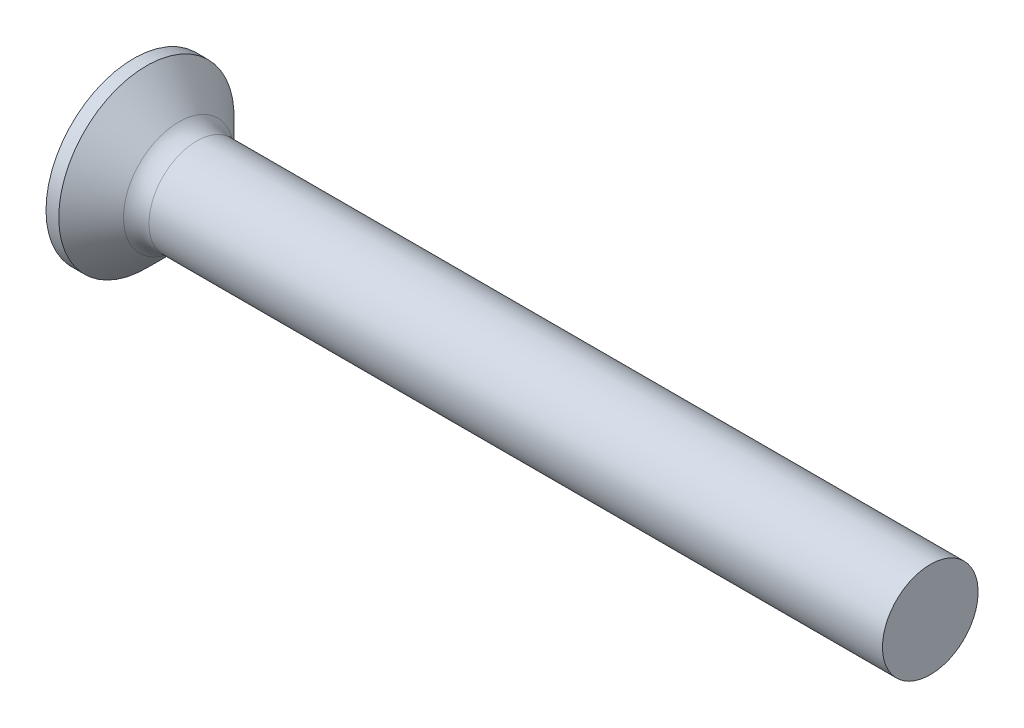
ISO-10303-21;
HEADER;
FILE_DESCRIPTION(('STEP AP214'),'2;1');
FILE_NAME('part.step','',(''),(''),'','','');
FILE_SCHEMA(('AUTOMOTIVE_DESIGN { 1 0 10303 214 1 1 1 1 }'));
ENDSEC;
DATA;
#1=APPLICATION_CONTEXT('core data for automotive mechanical design processes');
#2=APPLICATION_PROTOCOL_DEFINITION('international standard','automotive_design',2000,#1);
#3=PRODUCT_CONTEXT('',#1,'mechanical');
#4=PRODUCT('Part','Part','',(#3));
#5=PRODUCT_RELATED_PRODUCT_CATEGORY('part','',(#4));
#6=PRODUCT_DEFINITION_FORMATION('','',#4);
#7=PRODUCT_DEFINITION_CONTEXT('part definition',#1,'design');
#8=PRODUCT_DEFINITION('design','',#6,#7);
#9=PRODUCT_DEFINITION_SHAPE('','',#8);
#10=(LENGTH_UNIT() NAMED_UNIT(*) SI_UNIT(.MILLI.,.METRE.));
#11=(NAMED_UNIT(*) PLANE_ANGLE_UNIT() SI_UNIT($,.RADIAN.));
#12=(NAMED_UNIT(*) SI_UNIT($,.STERADIAN.) SOLID_ANGLE_UNIT());
#13=UNCERTAINTY_MEASURE_WITH_UNIT(LENGTH_MEASURE(1.E-05),#10,'distance_accuracy_value','');
#14=(GEOMETRIC_REPRESENTATION_CONTEXT(3) GLOBAL_UNCERTAINTY_ASSIGNED_CONTEXT((#13)) GLOBAL_UNIT_ASSIGNED_CONTEXT((#10,
#11,#12)) REPRESENTATION_CONTEXT('',''));
#15=CARTESIAN_POINT('',(0.,0.,0.));
#16=DIRECTION('',(0.,0.,1.));
#17=DIRECTION('',(1.,0.,0.));
#18=AXIS2_PLACEMENT_3D('',#15,#16,#17);
#19=CARTESIAN_POINT('',(2.01,-0.497851135403458,0.37));
#20=DIRECTION('',(0.,0.,-1.));
#21=DIRECTION('',(0.,1.,0.));
#22=AXIS2_PLACEMENT_3D('',#19,#20,#21);
#23=PLANE('',#22);
#24=DIRECTION('',(0.,-1.,0.));
#25=VECTOR('',#24,1.);
#26=CARTESIAN_POINT('',(0.,1.5,0.37));
#27=LINE('',#26,#25);
#28=CARTESIAN_POINT('',(0.,-0.590157547916263,0.37));
#29=VERTEX_POINT('',#28);
#30=CARTESIAN_POINT('',(0.,-1.5,0.37));
#31=VERTEX_POINT('',#30);
#32=EDGE_CURVE('E459',#29,#31,#27,.T.);
#33=ORIENTED_EDGE('',*,*,#32,.F.);
#34=CARTESIAN_POINT('',(-1.01053649691082,-0.672102030072118,0.37));
#35=CARTESIAN_POINT('',(-0.79970605871103,-0.655267098883947,0.37));
#36=CARTESIAN_POINT('',(-0.588886212503304,-0.638297110572311,0.37));
#37=CARTESIAN_POINT('',(-0.167272662529611,-0.603984130519828,0.37));
#38=CARTESIAN_POINT('',(0.0435210406290471,-0.586641131324258,0.37));
#39=CARTESIAN_POINT('',(0.465068838244709,-0.551479911667385,0.37));
#40=CARTESIAN_POINT('',(0.67582293271526,-0.533661691368909,0.37));
#41=CARTESIAN_POINT('',(1.09727362083221,-0.497387538872971,0.37));
#42=CARTESIAN_POINT('',(1.30797021521736,-0.478931615299089,0.37));
#43=CARTESIAN_POINT('',(1.67418894757201,-0.446067164121905,0.37));
#44=CARTESIAN_POINT('',(1.82972932585734,-0.431862501028414,0.37));
#45=CARTESIAN_POINT('',(2.14074770359484,-0.40279770973988,0.37));
#46=CARTESIAN_POINT('',(2.29622570356215,-0.38793758707517,0.37));
#47=CARTESIAN_POINT('',(2.60710169348415,-0.357305117937676,0.37));
#48=CARTESIAN_POINT('',(2.76249967840253,-0.34153271979064,0.37));
#49=CARTESIAN_POINT('',(2.99549070742189,-0.316847908281595,0.37));
#50=CARTESIAN_POINT('',(3.07313791118864,-0.308448465897182,0.37));
#51=CARTESIAN_POINT('',(3.22838341575769,-0.291202251048339,0.37));
#52=CARTESIAN_POINT('',(3.30598171599396,-0.282355473499083,0.37));
#53=CARTESIAN_POINT('',(3.38354828463398,-0.273232461289951,0.37));
#54=B_SPLINE_CURVE_WITH_KNOTS('',3,(#34,#35,#36,#37,#38,#39,#40,#41,#42,#43,#44,#45,#46,#47,#48,
#49,#50,#51,#52,#53),.UNSPECIFIED.,.F.,.F.,(4,2,2,2,2,2,2,2,2,4),(0.,0.634504777554396,
1.26902224766093,1.90353950036111,2.53804817592041,3.00661008438666,3.47516804019383,
3.94375256268972,4.17805198331267,4.41235406779909),.UNSPECIFIED.);
#55=CARTESIAN_POINT('',(2.01,-0.415013252800437,0.37));
#56=VERTEX_POINT('',#55);
#57=EDGE_CURVE('E214',#29,#56,#54,.T.);
#58=ORIENTED_EDGE('',*,*,#57,.T.);
#59=DIRECTION('',(0.,-1.,0.));
#60=VECTOR('',#59,1.);
#61=CARTESIAN_POINT('',(2.01,0.497851135403459,0.37));
#62=LINE('',#61,#60);
#63=CARTESIAN_POINT('',(2.01,-0.497851135403458,0.37));
#64=VERTEX_POINT('',#63);
#65=EDGE_CURVE('E367',#56,#64,#62,.T.);
#66=ORIENTED_EDGE('',*,*,#65,.T.);
#67=DIRECTION('',(0.894934391398442,0.446197753347436,0.));
#68=VECTOR('',#67,1.);
#69=CARTESIAN_POINT('',(0.,-1.5,0.37));
#70=LINE('',#69,#68);
#71=EDGE_CURVE('E467',#31,#64,#70,.T.);
#72=ORIENTED_EDGE('',*,*,#71,.F.);
#73=EDGE_LOOP('',(#33,#58,#66,#72));
#74=FACE_BOUND('',#73,.T.);
#75=ADVANCED_FACE('F35',(#74),#23,.T.);
#76=CARTESIAN_POINT('',(2.01,0.497851135403459,0.37));
#77=VERTEX_POINT('',#76);
#78=CARTESIAN_POINT('',(2.01,0.415013252800437,0.37));
#79=VERTEX_POINT('',#78);
#80=EDGE_CURVE('E363',#77,#79,#62,.T.);
#81=ORIENTED_EDGE('',*,*,#80,.T.);
#82=CARTESIAN_POINT('',(-1.01053649699026,0.672102030078459,0.37));
#83=CARTESIAN_POINT('',(-0.799706058781648,0.65526709888962,0.37));
#84=CARTESIAN_POINT('',(-0.588886212565099,0.638297110577309,0.37));
#85=CARTESIAN_POINT('',(-0.167272662573759,0.603984130523453,0.37));
#86=CARTESIAN_POINT('',(0.043521040593722,0.586641131327185,0.37));
#87=CARTESIAN_POINT('',(0.465068838236453,0.551479911668094,0.37));
#88=CARTESIAN_POINT('',(0.675822932725248,0.533661691368078,0.37));
#89=CARTESIAN_POINT('',(1.09727362087867,0.497387538868943,0.37));
#90=CARTESIAN_POINT('',(1.30797021528206,0.478931615293404,0.37));
#91=CARTESIAN_POINT('',(1.67418894765493,0.446067164114376,0.37));
#92=CARTESIAN_POINT('',(1.82972932594025,0.431862501020785,0.37));
#93=CARTESIAN_POINT('',(2.14074770367772,0.402797709732015,0.37));
#94=CARTESIAN_POINT('',(2.29622570364503,0.38793758706717,0.37));
#95=CARTESIAN_POINT('',(2.60710169356699,0.357305117929346,0.37));
#96=CARTESIAN_POINT('',(2.76249967848536,0.341532719782116,0.37));
#97=CARTESIAN_POINT('',(2.99549070750468,0.316847908272698,0.37));
#98=CARTESIAN_POINT('',(3.07313791127142,0.308448465888148,0.37));
#99=CARTESIAN_POINT('',(3.22838341584044,0.291202251038989,0.37));
#100=CARTESIAN_POINT('',(3.30598171607669,0.282355473489554,0.37));
#101=CARTESIAN_POINT('',(3.38354828471668,0.273232461280216,0.37));
#102=B_SPLINE_CURVE_WITH_KNOTS('',3,(#82,#83,#84,#85,#86,#87,#88,#89,#90,#91,#92,#93,#94,#95,
#96,#97,#98,#99,#100,#101),.UNSPECIFIED.,.F.,.F.,(4,2,2,2,2,2,2,2,2,4),(0.,0.634504777580944,
1.26902224771403,1.90353950046914,2.53804817608336,3.00661008454961,3.47516804035678,
3.94375256285268,4.17805198347564,4.41235406796206),.UNSPECIFIED.);
#103=CARTESIAN_POINT('',(0.,0.590157547916263,0.37));
#104=VERTEX_POINT('',#103);
#105=EDGE_CURVE('E207',#79,#104,#102,.F.);
#106=ORIENTED_EDGE('',*,*,#105,.T.);
#107=CARTESIAN_POINT('',(0.,1.5,0.37));
#108=VERTEX_POINT('',#107);
#109=EDGE_CURVE('E461',#108,#104,#27,.T.);
#110=ORIENTED_EDGE('',*,*,#109,.F.);
#111=DIRECTION('',(0.894934391398442,-0.446197753347436,0.));
#112=VECTOR('',#111,1.);
#113=CARTESIAN_POINT('',(0.,1.5,0.37));
#114=LINE('',#113,#112);
#115=EDGE_CURVE('E58',#108,#77,#114,.T.);
#116=ORIENTED_EDGE('',*,*,#115,.T.);
#117=EDGE_LOOP('',(#81,#106,#110,#116));
#118=FACE_BOUND('',#117,.T.);
#119=ADVANCED_FACE('F189',(#118),#23,.T.);
#120=CARTESIAN_POINT('',(2.01,0.497851135403459,-0.37));
#121=DIRECTION('',(0.,0.,1.));
#122=DIRECTION('',(1.,0.,0.));
#123=AXIS2_PLACEMENT_3D('',#120,#121,#122);
#124=PLANE('',#123);
#125=DIRECTION('',(0.,1.,0.));
#126=VECTOR('',#125,1.);
#127=CARTESIAN_POINT('',(2.01,-0.497851135403458,-0.37));
#128=LINE('',#127,#126);
#129=CARTESIAN_POINT('',(2.01,-0.497851135403458,-0.37));
#130=VERTEX_POINT('',#129);
#131=CARTESIAN_POINT('',(2.01,-0.415013252800437,-0.37));
#132=VERTEX_POINT('',#131);
#133=EDGE_CURVE('E376',#130,#132,#128,.T.);
#134=ORIENTED_EDGE('',*,*,#133,.T.);
#135=CARTESIAN_POINT('',(-1.01053649691082,-0.672102030072118,-0.37));
#136=CARTESIAN_POINT('',(-0.79970605871103,-0.655267098883947,-0.37));
#137=CARTESIAN_POINT('',(-0.588886212503304,-0.638297110572311,-0.37));
#138=CARTESIAN_POINT('',(-0.167272662529611,-0.603984130519828,-0.37));
#139=CARTESIAN_POINT('',(0.0435210406290471,-0.586641131324258,-0.37));
#140=CARTESIAN_POINT('',(0.465068838244709,-0.551479911667385,-0.37));
#141=CARTESIAN_POINT('',(0.67582293271526,-0.533661691368909,-0.37));
#142=CARTESIAN_POINT('',(1.09727362083221,-0.497387538872971,-0.37));
#143=CARTESIAN_POINT('',(1.30797021521736,-0.478931615299089,-0.37));
#144=CARTESIAN_POINT('',(1.67418894757201,-0.446067164121906,-0.37));
#145=CARTESIAN_POINT('',(1.82972932585734,-0.431862501028414,-0.37));
#146=CARTESIAN_POINT('',(2.14074770359484,-0.40279770973988,-0.37));
#147=CARTESIAN_POINT('',(2.29622570356215,-0.38793758707517,-0.37));
#148=CARTESIAN_POINT('',(2.60710169348415,-0.357305117937677,-0.37));
#149=CARTESIAN_POINT('',(2.76249967840253,-0.34153271979064,-0.37));
#150=CARTESIAN_POINT('',(2.99549070742189,-0.316847908281595,-0.37));
#151=CARTESIAN_POINT('',(3.07313791118864,-0.308448465897182,-0.37));
#152=CARTESIAN_POINT('',(3.22838341575769,-0.291202251048339,-0.37));
#153=CARTESIAN_POINT('',(3.30598171599396,-0.282355473499083,-0.37));
#154=CARTESIAN_POINT('',(3.38354828463398,-0.273232461289951,-0.37));
#155=B_SPLINE_CURVE_WITH_KNOTS('',3,(#135,#136,#137,#138,#139,#140,#141,#142,#143,#144,#145,
#146,#147,#148,#149,#150,#151,#152,#153,#154),.UNSPECIFIED.,.F.,.F.,(4,2,2,2,2,2,2,2,2,4),(0.,
0.634504777554396,1.26902224766093,1.90353950036111,2.53804817592041,3.00661008438666,
3.47516804019383,3.94375256268972,4.17805198331267,4.41235406779909),.UNSPECIFIED.);
#156=CARTESIAN_POINT('',(0.,-0.590157547916263,-0.37));
#157=VERTEX_POINT('',#156);
#158=EDGE_CURVE('E270',#132,#157,#155,.F.);
#159=ORIENTED_EDGE('',*,*,#158,.T.);
#160=DIRECTION('',(0.,1.,0.));
#161=VECTOR('',#160,1.);
#162=CARTESIAN_POINT('',(0.,-1.5,-0.37));
#163=LINE('',#162,#161);
#164=CARTESIAN_POINT('',(0.,-1.5,-0.37));
#165=VERTEX_POINT('',#164);
#166=EDGE_CURVE('E460',#165,#157,#163,.T.);
#167=ORIENTED_EDGE('',*,*,#166,.F.);
#168=DIRECTION('',(0.894934391398442,0.446197753347436,0.));
#169=VECTOR('',#168,1.);
#170=CARTESIAN_POINT('',(0.,-1.5,-0.37));
#171=LINE('',#170,#169);
#172=EDGE_CURVE('E470',#165,#130,#171,.T.);
#173=ORIENTED_EDGE('',*,*,#172,.T.);
#174=EDGE_LOOP('',(#134,#159,#167,#173));
#175=FACE_BOUND('',#174,.T.);
#176=ADVANCED_FACE('F195',(#175),#124,.T.);
#177=CARTESIAN_POINT('',(0.,0.590157547916263,-0.37));
#178=VERTEX_POINT('',#177);
#179=CARTESIAN_POINT('',(0.,1.5,-0.37));
#180=VERTEX_POINT('',#179);
#181=EDGE_CURVE('E466',#178,#180,#163,.T.);
#182=ORIENTED_EDGE('',*,*,#181,.F.);
#183=CARTESIAN_POINT('',(-1.01053649691082,0.672102030072118,-0.37));
#184=CARTESIAN_POINT('',(-0.79970605871103,0.655267098883947,-0.37));
#185=CARTESIAN_POINT('',(-0.588886212503304,0.638297110572311,-0.37));
#186=CARTESIAN_POINT('',(-0.167272662529611,0.603984130519828,-0.37));
#187=CARTESIAN_POINT('',(0.0435210406290471,0.586641131324258,-0.37));
#188=CARTESIAN_POINT('',(0.465068838244709,0.551479911667385,-0.37));
#189=CARTESIAN_POINT('',(0.67582293271526,0.533661691368909,-0.37));
#190=CARTESIAN_POINT('',(1.09727362083221,0.497387538872971,-0.37));
#191=CARTESIAN_POINT('',(1.30797021521736,0.478931615299089,-0.37));
#192=CARTESIAN_POINT('',(1.67418894757201,0.446067164121906,-0.37));
#193=CARTESIAN_POINT('',(1.82972932585734,0.431862501028415,-0.37));
#194=CARTESIAN_POINT('',(2.14074770359484,0.40279770973988,-0.37));
#195=CARTESIAN_POINT('',(2.29622570356215,0.38793758707517,-0.37));
#196=CARTESIAN_POINT('',(2.60710169348415,0.357305117937676,-0.37));
#197=CARTESIAN_POINT('',(2.76249967840253,0.34153271979064,-0.37));
#198=CARTESIAN_POINT('',(2.99549070742189,0.316847908281595,-0.37));
#199=CARTESIAN_POINT('',(3.07313791118864,0.308448465897182,-0.37));
#200=CARTESIAN_POINT('',(3.22838341575769,0.29120225104834,-0.37));
#201=CARTESIAN_POINT('',(3.30598171599396,0.282355473499083,-0.37));
#202=CARTESIAN_POINT('',(3.38354828463398,0.273232461289951,-0.37));
#203=B_SPLINE_CURVE_WITH_KNOTS('',3,(#183,#184,#185,#186,#187,#188,#189,#190,#191,#192,#193,
#194,#195,#196,#197,#198,#199,#200,#201,#202),.UNSPECIFIED.,.F.,.F.,(4,2,2,2,2,2,2,2,2,4),(0.,
0.634504777554396,1.26902224766093,1.90353950036111,2.53804817592041,3.00661008438666,
3.47516804019383,3.94375256268972,4.17805198331267,4.41235406779909),.UNSPECIFIED.);
#204=CARTESIAN_POINT('',(2.01,0.415013252800437,-0.37));
#205=VERTEX_POINT('',#204);
#206=EDGE_CURVE('E264',#178,#205,#203,.T.);
#207=ORIENTED_EDGE('',*,*,#206,.T.);
#208=CARTESIAN_POINT('',(2.01,0.497851135403459,-0.37));
#209=VERTEX_POINT('',#208);
#210=EDGE_CURVE('E378',#205,#209,#128,.T.);
#211=ORIENTED_EDGE('',*,*,#210,.T.);
#212=DIRECTION('',(0.894934391398442,-0.446197753347436,0.));
#213=VECTOR('',#212,1.);
#214=CARTESIAN_POINT('',(0.,1.5,-0.37));
#215=LINE('',#214,#213);
#216=EDGE_CURVE('E375',#180,#209,#215,.T.);
#217=ORIENTED_EDGE('',*,*,#216,.F.);
#218=EDGE_LOOP('',(#182,#207,#211,#217));
#219=FACE_BOUND('',#218,.T.);
#220=ADVANCED_FACE('F477',(#219),#124,.T.);
#221=CARTESIAN_POINT('',(2.01,0.497851135403459,-0.37));
#222=DIRECTION('',(1.,0.,0.));
#223=DIRECTION('',(0.,0.,-1.));
#224=AXIS2_PLACEMENT_3D('',#221,#222,#223);
#225=PLANE('',#224);
#226=CARTESIAN_POINT('',(2.01,0.,0.));
#227=DIRECTION('',(-1.,0.,0.));
#228=DIRECTION('',(0.,0.,1.));
#229=AXIS2_PLACEMENT_3D('',#226,#227,#228);
#230=CIRCLE('',#229,0.555999999999999);
#231=CARTESIAN_POINT('',(2.01,-0.24754847399547,-0.497851135403459));
#232=VERTEX_POINT('',#231);
#233=CARTESIAN_POINT('',(2.01,-0.369999999999999,-0.415013252800438));
#234=VERTEX_POINT('',#233);
#235=EDGE_CURVE('E342',#232,#234,#230,.T.);
#236=ORIENTED_EDGE('',*,*,#235,.F.);
#237=DIRECTION('',(0.,1.,0.));
#238=VECTOR('',#237,1.);
#239=CARTESIAN_POINT('',(2.01,-0.369999999999998,-0.49785113540346));
#240=LINE('',#239,#238);
#241=CARTESIAN_POINT('',(2.01,-0.369999999999998,-0.49785113540346));
#242=VERTEX_POINT('',#241);
#243=EDGE_CURVE('E444',#242,#232,#240,.T.);
#244=ORIENTED_EDGE('',*,*,#243,.F.);
#245=DIRECTION('',(0.,0.,-1.));
#246=VECTOR('',#245,1.);
#247=CARTESIAN_POINT('',(2.01,-0.370000000000002,0.497851135403457));
#248=LINE('',#247,#246);
#249=EDGE_CURVE('E448',#234,#242,#248,.T.);
#250=ORIENTED_EDGE('',*,*,#249,.F.);
#251=EDGE_LOOP('',(#236,#244,#250));
#252=FACE_BOUND('',#251,.T.);
#253=ADVANCED_FACE('F489',(#252),#225,.F.);
#254=CARTESIAN_POINT('',(2.01,-0.497851135403458,-0.247548473995471));
#255=VERTEX_POINT('',#254);
#256=EDGE_CURVE('E337',#132,#255,#230,.T.);
#257=ORIENTED_EDGE('',*,*,#256,.F.);
#258=ORIENTED_EDGE('',*,*,#133,.F.);
#259=DIRECTION('',(0.,0.,-1.));
#260=VECTOR('',#259,1.);
#261=CARTESIAN_POINT('',(2.01,-0.497851135403458,0.37));
#262=LINE('',#261,#260);
#263=EDGE_CURVE('E366',#255,#130,#262,.T.);
#264=ORIENTED_EDGE('',*,*,#263,.F.);
#265=EDGE_LOOP('',(#257,#258,#264));
#266=FACE_BOUND('',#265,.T.);
#267=ADVANCED_FACE('F495',(#266),#225,.F.);
#268=CARTESIAN_POINT('',(2.01,-0.497851135403458,0.247548473995472));
#269=VERTEX_POINT('',#268);
#270=EDGE_CURVE('E332',#269,#56,#230,.T.);
#271=ORIENTED_EDGE('',*,*,#270,.F.);
#272=EDGE_CURVE('E369',#64,#269,#262,.T.);
#273=ORIENTED_EDGE('',*,*,#272,.F.);
#274=ORIENTED_EDGE('',*,*,#65,.F.);
#275=EDGE_LOOP('',(#271,#273,#274));
#276=FACE_BOUND('',#275,.T.);
#277=ADVANCED_FACE('F501',(#276),#225,.F.);
#278=CARTESIAN_POINT('',(2.01,-0.370000000000001,0.415013252800436));
#279=VERTEX_POINT('',#278);
#280=CARTESIAN_POINT('',(2.01,-0.247548473995473,0.497851135403458));
#281=VERTEX_POINT('',#280);
#282=EDGE_CURVE('E50',#279,#281,#230,.T.);
#283=ORIENTED_EDGE('',*,*,#282,.F.);
#284=CARTESIAN_POINT('',(2.01,-0.370000000000002,0.497851135403457));
#285=VERTEX_POINT('',#284);
#286=EDGE_CURVE('E450',#285,#279,#248,.T.);
#287=ORIENTED_EDGE('',*,*,#286,.F.);
#288=DIRECTION('',(0.,-1.,0.));
#289=VECTOR('',#288,1.);
#290=CARTESIAN_POINT('',(2.01,0.369999999999998,0.49785113540346));
#291=LINE('',#290,#289);
#292=EDGE_CURVE('E449',#281,#285,#291,.T.);
#293=ORIENTED_EDGE('',*,*,#292,.F.);
#294=EDGE_LOOP('',(#283,#287,#293));
#295=FACE_BOUND('',#294,.T.);
#296=ADVANCED_FACE('F528',(#295),#225,.F.);
#297=CARTESIAN_POINT('',(2.01,0.24754847399547,0.497851135403459));
#298=VERTEX_POINT('',#297);
#299=CARTESIAN_POINT('',(2.01,0.369999999999999,0.415013252800438));
#300=VERTEX_POINT('',#299);
#301=EDGE_CURVE('E323',#298,#300,#230,.T.);
#302=ORIENTED_EDGE('',*,*,#301,.F.);
#303=CARTESIAN_POINT('',(2.01,0.369999999999998,0.49785113540346));
#304=VERTEX_POINT('',#303);
#305=EDGE_CURVE('E445',#304,#298,#291,.T.);
#306=ORIENTED_EDGE('',*,*,#305,.F.);
#307=DIRECTION('',(0.,0.,1.));
#308=VECTOR('',#307,1.);
#309=CARTESIAN_POINT('',(2.01,0.370000000000002,-0.497851135403457));
#310=LINE('',#309,#308);
#311=EDGE_CURVE('E221',#300,#304,#310,.T.);
#312=ORIENTED_EDGE('',*,*,#311,.F.);
#313=EDGE_LOOP('',(#302,#306,#312));
#314=FACE_BOUND('',#313,.T.);
#315=ADVANCED_FACE('F486',(#314),#225,.F.);
#316=CARTESIAN_POINT('',(2.01,0.497851135403459,0.247548473995471));
#317=VERTEX_POINT('',#316);
#318=EDGE_CURVE('E330',#79,#317,#230,.T.);
#319=ORIENTED_EDGE('',*,*,#318,.F.);
#320=ORIENTED_EDGE('',*,*,#80,.F.);
#321=DIRECTION('',(0.,0.,1.));
#322=VECTOR('',#321,1.);
#323=CARTESIAN_POINT('',(2.01,0.497851135403459,-0.37));
#324=LINE('',#323,#322);
#325=EDGE_CURVE('E364',#317,#77,#324,.T.);
#326=ORIENTED_EDGE('',*,*,#325,.F.);
#327=EDGE_LOOP('',(#319,#320,#326));
#328=FACE_BOUND('',#327,.T.);
#329=ADVANCED_FACE('F362',(#328),#225,.F.);
#330=CARTESIAN_POINT('',(2.01,0.497851135403458,-0.247548473995471));
#331=VERTEX_POINT('',#330);
#332=EDGE_CURVE('E352',#331,#205,#230,.T.);
#333=ORIENTED_EDGE('',*,*,#332,.F.);
#334=EDGE_CURVE('E371',#209,#331,#324,.T.);
#335=ORIENTED_EDGE('',*,*,#334,.F.);
#336=ORIENTED_EDGE('',*,*,#210,.F.);
#337=EDGE_LOOP('',(#333,#335,#336));
#338=FACE_BOUND('',#337,.T.);
#339=ADVANCED_FACE('F479',(#338),#225,.F.);
#340=CARTESIAN_POINT('',(2.01,-0.497851135403458,-0.37));
#341=DIRECTION('',(-0.446197753347436,0.894934391398443,0.));
#342=DIRECTION('',(-0.894934391398442,-0.446197753347436,0.));
#343=AXIS2_PLACEMENT_3D('',#340,#341,#342);
#344=PLANE('',#343);
#345=ORIENTED_EDGE('',*,*,#272,.T.);
#346=CARTESIAN_POINT('',(2.86902919914418,-0.0695550475538963,0.));
#347=DIRECTION('',(-0.446197753347436,0.894934391398443,0.));
#348=DIRECTION('',(-0.894934391398443,-0.446197753347436,0.));
#349=AXIS2_PLACEMENT_3D('',#346,#347,#348);
#350=ELLIPSE('',#349,1.11145971268776,0.491029001453358);
#351=EDGE_CURVE('E282',#269,#255,#350,.F.);
#352=ORIENTED_EDGE('',*,*,#351,.T.);
#353=ORIENTED_EDGE('',*,*,#263,.T.);
#354=ORIENTED_EDGE('',*,*,#172,.F.);
#355=DIRECTION('',(0.,0.,-1.));
#356=VECTOR('',#355,1.);
#357=CARTESIAN_POINT('',(0.,-1.5,0.37));
#358=LINE('',#357,#356);
#359=EDGE_CURVE('E383',#31,#165,#358,.T.);
#360=ORIENTED_EDGE('',*,*,#359,.F.);
#361=ORIENTED_EDGE('',*,*,#71,.T.);
#362=EDGE_LOOP('',(#345,#352,#353,#354,#360,#361));
#363=FACE_BOUND('',#362,.T.);
#364=ADVANCED_FACE('F201',(#363),#344,.T.);
#365=CARTESIAN_POINT('',(0.,1.5,0.37));
#366=DIRECTION('',(-0.446197753347436,-0.894934391398443,0.));
#367=DIRECTION('',(0.894934391398442,-0.446197753347436,0.));
#368=AXIS2_PLACEMENT_3D('',#365,#366,#367);
#369=PLANE('',#368);
#370=ORIENTED_EDGE('',*,*,#334,.T.);
#371=CARTESIAN_POINT('',(2.86902919914418,0.0695550475538963,0.));
#372=DIRECTION('',(-0.446197753347436,-0.894934391398443,0.));
#373=DIRECTION('',(-0.894934391398443,0.446197753347436,0.));
#374=AXIS2_PLACEMENT_3D('',#371,#372,#373);
#375=ELLIPSE('',#374,1.11145971268776,0.491029001453358);
#376=EDGE_CURVE('E287',#331,#317,#375,.F.);
#377=ORIENTED_EDGE('',*,*,#376,.T.);
#378=ORIENTED_EDGE('',*,*,#325,.T.);
#379=ORIENTED_EDGE('',*,*,#115,.F.);
#380=DIRECTION('',(0.,0.,1.));
#381=VECTOR('',#380,1.);
#382=CARTESIAN_POINT('',(0.,1.5,-0.37));
#383=LINE('',#382,#381);
#384=EDGE_CURVE('E456',#180,#108,#383,.T.);
#385=ORIENTED_EDGE('',*,*,#384,.F.);
#386=ORIENTED_EDGE('',*,*,#216,.T.);
#387=EDGE_LOOP('',(#370,#377,#378,#379,#385,#386));
#388=FACE_BOUND('',#387,.T.);
#389=ADVANCED_FACE('F475',(#388),#369,.T.);
#390=CARTESIAN_POINT('',(2.01,0.369999999999998,0.49785113540346));
#391=DIRECTION('',(0.,-1.,0.));
#392=DIRECTION('',(1.,0.,0.));
#393=AXIS2_PLACEMENT_3D('',#390,#391,#392);
#394=PLANE('',#393);
#395=CARTESIAN_POINT('',(2.01,0.370000000000002,-0.497851135403457));
#396=VERTEX_POINT('',#395);
#397=CARTESIAN_POINT('',(2.01,0.370000000000001,-0.415013252800436));
#398=VERTEX_POINT('',#397);
#399=EDGE_CURVE('E454',#396,#398,#310,.T.);
#400=ORIENTED_EDGE('',*,*,#399,.T.);
#401=CARTESIAN_POINT('',(-1.01053649691082,0.370000000000002,-0.672102030072116));
#402=CARTESIAN_POINT('',(-0.79970605871103,0.370000000000002,-0.655267098883946));
#403=CARTESIAN_POINT('',(-0.588886212503304,0.370000000000002,-0.63829711057231));
#404=CARTESIAN_POINT('',(-0.167272662529611,0.370000000000002,-0.603984130519827));
#405=CARTESIAN_POINT('',(0.0435210406290471,0.370000000000002,-0.586641131324257));
#406=CARTESIAN_POINT('',(0.465068838244709,0.370000000000002,-0.551479911667384));
#407=CARTESIAN_POINT('',(0.67582293271526,0.370000000000002,-0.533661691368908));
#408=CARTESIAN_POINT('',(1.09727362083221,0.370000000000002,-0.49738753887297));
#409=CARTESIAN_POINT('',(1.30797021521736,0.370000000000002,-0.478931615299088));
#410=CARTESIAN_POINT('',(1.67418894757201,0.370000000000001,-0.446067164121904));
#411=CARTESIAN_POINT('',(1.82972932585734,0.370000000000001,-0.431862501028413));
#412=CARTESIAN_POINT('',(2.14074770359484,0.370000000000001,-0.402797709739879));
#413=CARTESIAN_POINT('',(2.29622570356215,0.370000000000001,-0.387937587075169));
#414=CARTESIAN_POINT('',(2.60710169348415,0.370000000000001,-0.357305117937675));
#415=CARTESIAN_POINT('',(2.76249967840253,0.370000000000001,-0.341532719790639));
#416=CARTESIAN_POINT('',(2.99549070742189,0.370000000000001,-0.316847908281593));
#417=CARTESIAN_POINT('',(3.07313791118864,0.370000000000001,-0.308448465897181));
#418=CARTESIAN_POINT('',(3.22838341575769,0.370000000000001,-0.291202251048338));
#419=CARTESIAN_POINT('',(3.30598171599396,0.370000000000001,-0.282355473499081));
#420=CARTESIAN_POINT('',(3.38354828463398,0.370000000000001,-0.27323246128995));
#421=B_SPLINE_CURVE_WITH_KNOTS('',3,(#401,#402,#403,#404,#405,#406,#407,#408,#409,#410,#411,
#412,#413,#414,#415,#416,#417,#418,#419,#420),.UNSPECIFIED.,.F.,.F.,(4,2,2,2,2,2,2,2,2,4),(0.,
0.634504777554396,1.26902224766093,1.90353950036111,2.53804817592041,3.00661008438666,
3.47516804019383,3.94375256268972,4.17805198331267,4.41235406779909),.UNSPECIFIED.);
#422=CARTESIAN_POINT('',(0.,0.370000000000002,-0.590157547916262));
#423=VERTEX_POINT('',#422);
#424=EDGE_CURVE('E256',#398,#423,#421,.F.);
#425=ORIENTED_EDGE('',*,*,#424,.T.);
#426=DIRECTION('',(0.,0.,1.));
#427=VECTOR('',#426,1.);
#428=CARTESIAN_POINT('',(0.,0.370000000000005,-1.5));
#429=LINE('',#428,#427);
#430=CARTESIAN_POINT('',(0.,0.370000000000005,-1.5));
#431=VERTEX_POINT('',#430);
#432=EDGE_CURVE('E430',#431,#423,#429,.T.);
#433=ORIENTED_EDGE('',*,*,#432,.F.);
#434=DIRECTION('',(0.894934391398442,0.,0.446197753347436));
#435=VECTOR('',#434,1.);
#436=CARTESIAN_POINT('',(0.,0.370000000000005,-1.5));
#437=LINE('',#436,#435);
#438=EDGE_CURVE('E436',#431,#396,#437,.T.);
#439=ORIENTED_EDGE('',*,*,#438,.T.);
#440=EDGE_LOOP('',(#400,#425,#433,#439));
#441=FACE_BOUND('',#440,.T.);
#442=ADVANCED_FACE('F608',(#441),#394,.T.);
#443=CARTESIAN_POINT('',(2.01,-0.369999999999998,-0.497851135403459));
#444=DIRECTION('',(0.,1.,0.));
#445=DIRECTION('',(0.,0.,1.));
#446=AXIS2_PLACEMENT_3D('',#443,#444,#445);
#447=PLANE('',#446);
#448=DIRECTION('',(0.,0.,-1.));
#449=VECTOR('',#448,1.);
#450=CARTESIAN_POINT('',(0.,-0.370000000000005,1.5));
#451=LINE('',#450,#449);
#452=CARTESIAN_POINT('',(0.,-0.369999999999998,-0.590157547916264));
#453=VERTEX_POINT('',#452);
#454=CARTESIAN_POINT('',(0.,-0.369999999999995,-1.5));
#455=VERTEX_POINT('',#454);
#456=EDGE_CURVE('E426',#453,#455,#451,.T.);
#457=ORIENTED_EDGE('',*,*,#456,.F.);
#458=CARTESIAN_POINT('',(-1.01053649699026,-0.369999999999998,-0.67210203007846));
#459=CARTESIAN_POINT('',(-0.799706058781648,-0.369999999999998,-0.655267098889621));
#460=CARTESIAN_POINT('',(-0.588886212565099,-0.369999999999998,-0.638297110577311));
#461=CARTESIAN_POINT('',(-0.167272662573759,-0.369999999999998,-0.603984130523454));
#462=CARTESIAN_POINT('',(0.043521040593722,-0.369999999999998,-0.586641131327186));
#463=CARTESIAN_POINT('',(0.465068838236453,-0.369999999999998,-0.551479911668095));
#464=CARTESIAN_POINT('',(0.675822932725248,-0.369999999999998,-0.53366169136808));
#465=CARTESIAN_POINT('',(1.09727362087867,-0.369999999999998,-0.497387538868944));
#466=CARTESIAN_POINT('',(1.30797021528206,-0.369999999999998,-0.478931615293405));
#467=CARTESIAN_POINT('',(1.67418894765493,-0.369999999999999,-0.446067164114377));
#468=CARTESIAN_POINT('',(1.82972932594025,-0.369999999999999,-0.431862501020786));
#469=CARTESIAN_POINT('',(2.14074770367772,-0.369999999999999,-0.402797709732017));
#470=CARTESIAN_POINT('',(2.29622570364503,-0.369999999999999,-0.387937587067171));
#471=CARTESIAN_POINT('',(2.60710169356699,-0.369999999999999,-0.357305117929348));
#472=CARTESIAN_POINT('',(2.76249967848536,-0.369999999999999,-0.341532719782117));
#473=CARTESIAN_POINT('',(2.99549070750468,-0.369999999999999,-0.316847908272699));
#474=CARTESIAN_POINT('',(3.07313791127142,-0.369999999999999,-0.308448465888149));
#475=CARTESIAN_POINT('',(3.22838341584044,-0.369999999999999,-0.29120225103899));
#476=CARTESIAN_POINT('',(3.30598171607669,-0.369999999999999,-0.282355473489555));
#477=CARTESIAN_POINT('',(3.38354828471668,-0.369999999999999,-0.273232461280217));
#478=B_SPLINE_CURVE_WITH_KNOTS('',3,(#458,#459,#460,#461,#462,#463,#464,#465,#466,#467,#468,
#469,#470,#471,#472,#473,#474,#475,#476,#477),.UNSPECIFIED.,.F.,.F.,(4,2,2,2,2,2,2,2,2,4),(0.,
0.634504777580944,1.26902224771403,1.90353950046914,2.53804817608336,3.00661008454961,
3.47516804035678,3.94375256285268,4.17805198347564,4.41235406796206),.UNSPECIFIED.);
#479=EDGE_CURVE('E249',#453,#234,#478,.T.);
#480=ORIENTED_EDGE('',*,*,#479,.T.);
#481=ORIENTED_EDGE('',*,*,#249,.T.);
#482=DIRECTION('',(0.894934391398442,0.,0.446197753347436));
#483=VECTOR('',#482,1.);
#484=CARTESIAN_POINT('',(0.,-0.369999999999995,-1.5));
#485=LINE('',#484,#483);
#486=EDGE_CURVE('E433',#455,#242,#485,.T.);
#487=ORIENTED_EDGE('',*,*,#486,.F.);
#488=EDGE_LOOP('',(#457,#480,#481,#487));
#489=FACE_BOUND('',#488,.T.);
#490=ADVANCED_FACE('F506',(#489),#447,.T.);
#491=CARTESIAN_POINT('',(2.01,0.370000000000002,-0.497851135403457));
#492=DIRECTION('',(-0.446197753347436,0.,0.894934391398443));
#493=DIRECTION('',(-0.894934391398442,0.,-0.446197753347436));
#494=AXIS2_PLACEMENT_3D('',#491,#492,#493);
#495=PLANE('',#494);
#496=ORIENTED_EDGE('',*,*,#243,.T.);
#497=CARTESIAN_POINT('',(2.86902919914418,0.,-0.0695550475538964));
#498=DIRECTION('',(-0.446197753347436,0.,0.894934391398443));
#499=DIRECTION('',(-0.894934391398443,0.,-0.446197753347436));
#500=AXIS2_PLACEMENT_3D('',#497,#498,#499);
#501=ELLIPSE('',#500,1.11145971268776,0.491029001453358);
#502=CARTESIAN_POINT('',(2.01,0.247548473995473,-0.497851135403457));
#503=VERTEX_POINT('',#502);
#504=EDGE_CURVE('E300',#232,#503,#501,.F.);
#505=ORIENTED_EDGE('',*,*,#504,.T.);
#506=EDGE_CURVE('E452',#503,#396,#240,.T.);
#507=ORIENTED_EDGE('',*,*,#506,.T.);
#508=ORIENTED_EDGE('',*,*,#438,.F.);
#509=DIRECTION('',(0.,1.,0.));
#510=VECTOR('',#509,1.);
#511=CARTESIAN_POINT('',(0.,-0.369999999999995,-1.5));
#512=LINE('',#511,#510);
#513=EDGE_CURVE('E425',#455,#431,#512,.T.);
#514=ORIENTED_EDGE('',*,*,#513,.F.);
#515=ORIENTED_EDGE('',*,*,#486,.T.);
#516=EDGE_LOOP('',(#496,#505,#507,#508,#514,#515));
#517=FACE_BOUND('',#516,.T.);
#518=ADVANCED_FACE('F226',(#517),#495,.T.);
#519=ORIENTED_EDGE('',*,*,#286,.T.);
#520=CARTESIAN_POINT('',(-1.01053649699026,-0.370000000000002,0.672102030078458));
#521=CARTESIAN_POINT('',(-0.799706058781648,-0.370000000000002,0.655267098889619));
#522=CARTESIAN_POINT('',(-0.588886212565099,-0.370000000000002,0.638297110577308));
#523=CARTESIAN_POINT('',(-0.167272662573759,-0.370000000000002,0.603984130523451));
#524=CARTESIAN_POINT('',(0.0435210405937219,-0.370000000000002,0.586641131327183));
#525=CARTESIAN_POINT('',(0.465068838236453,-0.370000000000002,0.551479911668093));
#526=CARTESIAN_POINT('',(0.675822932725248,-0.370000000000002,0.533661691368077));
#527=CARTESIAN_POINT('',(1.09727362087867,-0.370000000000002,0.497387538868941));
#528=CARTESIAN_POINT('',(1.30797021528206,-0.370000000000002,0.478931615293403));
#529=CARTESIAN_POINT('',(1.67418894765493,-0.370000000000002,0.446067164114375));
#530=CARTESIAN_POINT('',(1.82972932594025,-0.370000000000001,0.431862501020784));
#531=CARTESIAN_POINT('',(2.14074770367772,-0.370000000000001,0.402797709732014));
#532=CARTESIAN_POINT('',(2.29622570364503,-0.370000000000001,0.387937587067169));
#533=CARTESIAN_POINT('',(2.60710169356699,-0.370000000000001,0.357305117929345));
#534=CARTESIAN_POINT('',(2.76249967848536,-0.370000000000001,0.341532719782114));
#535=CARTESIAN_POINT('',(2.99549070750468,-0.370000000000001,0.316847908272697));
#536=CARTESIAN_POINT('',(3.07313791127142,-0.370000000000001,0.308448465888147));
#537=CARTESIAN_POINT('',(3.22838341584044,-0.370000000000001,0.291202251038988));
#538=CARTESIAN_POINT('',(3.30598171607669,-0.370000000000001,0.282355473489552));
#539=CARTESIAN_POINT('',(3.38354828471668,-0.370000000000001,0.273232461280214));
#540=B_SPLINE_CURVE_WITH_KNOTS('',3,(#520,#521,#522,#523,#524,#525,#526,#527,#528,#529,#530,
#531,#532,#533,#534,#535,#536,#537,#538,#539),.UNSPECIFIED.,.F.,.F.,(4,2,2,2,2,2,2,2,2,4),(0.,
0.634504777580944,1.26902224771403,1.90353950046914,2.53804817608336,3.00661008454961,
3.47516804035678,3.94375256285268,4.17805198347564,4.41235406796206),.UNSPECIFIED.);
#541=CARTESIAN_POINT('',(0.,-0.370000000000002,0.590157547916262));
#542=VERTEX_POINT('',#541);
#543=EDGE_CURVE('E241',#279,#542,#540,.F.);
#544=ORIENTED_EDGE('',*,*,#543,.T.);
#545=CARTESIAN_POINT('',(0.,-0.370000000000005,1.5));
#546=VERTEX_POINT('',#545);
#547=EDGE_CURVE('E421',#546,#542,#451,.T.);
#548=ORIENTED_EDGE('',*,*,#547,.F.);
#549=DIRECTION('',(0.894934391398442,0.,-0.446197753347436));
#550=VECTOR('',#549,1.);
#551=CARTESIAN_POINT('',(0.,-0.370000000000005,1.5));
#552=LINE('',#551,#550);
#553=EDGE_CURVE('E439',#546,#285,#552,.T.);
#554=ORIENTED_EDGE('',*,*,#553,.T.);
#555=EDGE_LOOP('',(#519,#544,#548,#554));
#556=FACE_BOUND('',#555,.T.);
#557=ADVANCED_FACE('F526',(#556),#447,.T.);
#558=CARTESIAN_POINT('',(0.,0.369999999999998,0.590157547916264));
#559=VERTEX_POINT('',#558);
#560=CARTESIAN_POINT('',(0.,0.369999999999995,1.5));
#561=VERTEX_POINT('',#560);
#562=EDGE_CURVE('E432',#559,#561,#429,.T.);
#563=ORIENTED_EDGE('',*,*,#562,.F.);
#564=CARTESIAN_POINT('',(-1.01053649699026,0.369999999999997,0.67210203007846));
#565=CARTESIAN_POINT('',(-0.799706058781648,0.369999999999997,0.655267098889622));
#566=CARTESIAN_POINT('',(-0.588886212565099,0.369999999999997,0.638297110577311));
#567=CARTESIAN_POINT('',(-0.167272662573758,0.369999999999998,0.603984130523454));
#568=CARTESIAN_POINT('',(0.043521040593722,0.369999999999998,0.586641131327186));
#569=CARTESIAN_POINT('',(0.465068838236453,0.369999999999998,0.551479911668095));
#570=CARTESIAN_POINT('',(0.675822932725248,0.369999999999998,0.53366169136808));
#571=CARTESIAN_POINT('',(1.09727362087867,0.369999999999998,0.497387538868944));
#572=CARTESIAN_POINT('',(1.30797021528206,0.369999999999998,0.478931615293405));
#573=CARTESIAN_POINT('',(1.67418894765493,0.369999999999998,0.446067164114377));
#574=CARTESIAN_POINT('',(1.82972932594025,0.369999999999998,0.431862501020786));
#575=CARTESIAN_POINT('',(2.14074770367772,0.369999999999999,0.402797709732017));
#576=CARTESIAN_POINT('',(2.29622570364503,0.369999999999999,0.387937587067171));
#577=CARTESIAN_POINT('',(2.60710169356699,0.369999999999999,0.357305117929348));
#578=CARTESIAN_POINT('',(2.76249967848536,0.369999999999999,0.341532719782117));
#579=CARTESIAN_POINT('',(2.99549070750468,0.369999999999999,0.316847908272699));
#580=CARTESIAN_POINT('',(3.07313791127142,0.369999999999999,0.308448465888149));
#581=CARTESIAN_POINT('',(3.22838341584044,0.369999999999999,0.29120225103899));
#582=CARTESIAN_POINT('',(3.30598171607669,0.369999999999999,0.282355473489555));
#583=CARTESIAN_POINT('',(3.38354828471668,0.369999999999999,0.273232461280217));
#584=B_SPLINE_CURVE_WITH_KNOTS('',3,(#564,#565,#566,#567,#568,#569,#570,#571,#572,#573,#574,
#575,#576,#577,#578,#579,#580,#581,#582,#583),.UNSPECIFIED.,.F.,.F.,(4,2,2,2,2,2,2,2,2,4),(0.,
0.634504777580944,1.26902224771403,1.90353950046914,2.53804817608336,3.00661008454961,
3.47516804035678,3.94375256285268,4.17805198347564,4.41235406796206),.UNSPECIFIED.);
#585=EDGE_CURVE('E231',#559,#300,#584,.T.);
#586=ORIENTED_EDGE('',*,*,#585,.T.);
#587=ORIENTED_EDGE('',*,*,#311,.T.);
#588=DIRECTION('',(0.894934391398442,0.,-0.446197753347436));
#589=VECTOR('',#588,1.);
#590=CARTESIAN_POINT('',(0.,0.369999999999995,1.5));
#591=LINE('',#590,#589);
#592=EDGE_CURVE('E441',#561,#304,#591,.T.);
#593=ORIENTED_EDGE('',*,*,#592,.F.);
#594=EDGE_LOOP('',(#563,#586,#587,#593));
#595=FACE_BOUND('',#594,.T.);
#596=ADVANCED_FACE('F521',(#595),#394,.T.);
#597=CARTESIAN_POINT('',(0.,-0.370000000000005,1.5));
#598=DIRECTION('',(-0.446197753347436,0.,-0.894934391398443));
#599=DIRECTION('',(0.894934391398442,0.,-0.446197753347436));
#600=AXIS2_PLACEMENT_3D('',#597,#598,#599);
#601=PLANE('',#600);
#602=ORIENTED_EDGE('',*,*,#305,.T.);
#603=CARTESIAN_POINT('',(2.86902919914418,0.,0.0695550475538963));
#604=DIRECTION('',(-0.446197753347436,0.,-0.894934391398443));
#605=DIRECTION('',(-0.894934391398443,0.,0.446197753347436));
#606=AXIS2_PLACEMENT_3D('',#603,#604,#605);
#607=ELLIPSE('',#606,1.11145971268776,0.491029001453358);
#608=EDGE_CURVE('E11',#298,#281,#607,.F.);
#609=ORIENTED_EDGE('',*,*,#608,.T.);
#610=ORIENTED_EDGE('',*,*,#292,.T.);
#611=ORIENTED_EDGE('',*,*,#553,.F.);
#612=DIRECTION('',(0.,-1.,0.));
#613=VECTOR('',#612,1.);
#614=CARTESIAN_POINT('',(0.,0.369999999999995,1.5));
#615=LINE('',#614,#613);
#616=EDGE_CURVE('E222',#561,#546,#615,.T.);
#617=ORIENTED_EDGE('',*,*,#616,.F.);
#618=ORIENTED_EDGE('',*,*,#592,.T.);
#619=EDGE_LOOP('',(#602,#609,#610,#611,#617,#618));
#620=FACE_BOUND('',#619,.T.);
#621=ADVANCED_FACE('F418',(#620),#601,.T.);
#622=CARTESIAN_POINT('',(0.,0.,0.));
#623=DIRECTION('',(-1.,0.,0.));
#624=DIRECTION('',(0.,0.,1.));
#625=AXIS2_PLACEMENT_3D('',#622,#623,#624);
#626=PLANE('',#625);
#627=CARTESIAN_POINT('',(0.,0.,0.));
#628=DIRECTION('',(-1.,0.,0.));
#629=DIRECTION('',(0.,0.,1.));
#630=AXIS2_PLACEMENT_3D('',#627,#628,#629);
#631=CIRCLE('',#630,2.75);
#632=CARTESIAN_POINT('',(0.,0.,2.75));
#633=VERTEX_POINT('',#632);
#634=EDGE_CURVE('E379',#633,#633,#631,.T.);
#635=ORIENTED_EDGE('',*,*,#634,.T.);
#636=EDGE_LOOP('',(#635));
#637=FACE_BOUND('',#636,.T.);
#638=ORIENTED_EDGE('',*,*,#547,.T.);
#639=CARTESIAN_POINT('',(0.,0.,0.));
#640=DIRECTION('',(-1.,0.,0.));
#641=DIRECTION('',(0.,0.,1.));
#642=AXIS2_PLACEMENT_3D('',#639,#640,#641);
#643=CIRCLE('',#642,0.696552892006441);
#644=EDGE_CURVE('E318',#29,#542,#643,.T.);
#645=ORIENTED_EDGE('',*,*,#644,.F.);
#646=ORIENTED_EDGE('',*,*,#32,.T.);
#647=ORIENTED_EDGE('',*,*,#359,.T.);
#648=ORIENTED_EDGE('',*,*,#166,.T.);
#649=EDGE_CURVE('E321',#453,#157,#643,.T.);
#650=ORIENTED_EDGE('',*,*,#649,.F.);
#651=ORIENTED_EDGE('',*,*,#456,.T.);
#652=ORIENTED_EDGE('',*,*,#513,.T.);
#653=ORIENTED_EDGE('',*,*,#432,.T.);
#654=EDGE_CURVE('E317',#178,#423,#643,.T.);
#655=ORIENTED_EDGE('',*,*,#654,.F.);
#656=ORIENTED_EDGE('',*,*,#181,.T.);
#657=ORIENTED_EDGE('',*,*,#384,.T.);
#658=ORIENTED_EDGE('',*,*,#109,.T.);
#659=EDGE_CURVE('E313',#559,#104,#643,.T.);
#660=ORIENTED_EDGE('',*,*,#659,.F.);
#661=ORIENTED_EDGE('',*,*,#562,.T.);
#662=ORIENTED_EDGE('',*,*,#616,.T.);
#663=EDGE_LOOP('',(#638,#645,#646,#647,#648,#650,#651,#652,#653,#655,#656,#657,#658,#660,#661,#662));
#664=FACE_BOUND('',#663,.T.);
#665=ADVANCED_FACE('F414',(#637,#664),#626,.T.);
#666=CARTESIAN_POINT('',(25.,1.5,0.));
#667=DIRECTION('',(1.,0.,0.));
#668=DIRECTION('',(0.,0.,-1.));
#669=AXIS2_PLACEMENT_3D('',#666,#667,#668);
#670=PLANE('',#669);
#671=CARTESIAN_POINT('',(25.,0.,0.));
#672=DIRECTION('',(-1.,0.,0.));
#673=DIRECTION('',(0.,0.,1.));
#674=AXIS2_PLACEMENT_3D('',#671,#672,#673);
#675=CIRCLE('',#674,1.5);
#676=CARTESIAN_POINT('',(25.,0.,1.5));
#677=VERTEX_POINT('',#676);
#678=EDGE_CURVE('E386',#677,#677,#675,.T.);
#679=ORIENTED_EDGE('',*,*,#678,.F.);
#680=EDGE_LOOP('',(#679));
#681=FACE_BOUND('',#680,.T.);
#682=ADVANCED_FACE('F417',(#681),#670,.T.);
#683=CARTESIAN_POINT('',(-6.34999999999999,0.,0.));
#684=DIRECTION('',(-1.,0.,0.));
#685=DIRECTION('',(0.,0.,1.));
#686=AXIS2_PLACEMENT_3D('',#683,#684,#685);
#687=CYLINDRICAL_SURFACE('',#686,1.5);
#688=CARTESIAN_POINT('',(1.98137084989848,0.,0.));
#689=DIRECTION('',(-1.,0.,0.));
#690=DIRECTION('',(0.,0.,1.));
#691=AXIS2_PLACEMENT_3D('',#688,#689,#690);
#692=CIRCLE('',#691,1.5);
#693=CARTESIAN_POINT('',(1.98137084989848,0.,1.5));
#694=VERTEX_POINT('',#693);
#695=EDGE_CURVE('E43',#694,#694,#692,.F.);
#696=ORIENTED_EDGE('',*,*,#695,.T.);
#697=EDGE_LOOP('',(#696));
#698=FACE_BOUND('',#697,.T.);
#699=ORIENTED_EDGE('',*,*,#678,.T.);
#700=EDGE_LOOP('',(#699));
#701=FACE_BOUND('',#700,.T.);
#702=ADVANCED_FACE('F394',(#698,#701),#687,.T.);
#703=CARTESIAN_POINT('',(0.400000000000005,0.,0.));
#704=DIRECTION('',(-1.,0.,0.));
#705=DIRECTION('',(0.,0.,1.));
#706=AXIS2_PLACEMENT_3D('',#703,#704,#705);
#707=CONICAL_SURFACE('',#706,2.75,0.78539816339745);
#708=CARTESIAN_POINT('',(1.41568542494924,0.,0.));
#709=DIRECTION('',(-1.,0.,0.));
#710=DIRECTION('',(0.,0.,1.));
#711=AXIS2_PLACEMENT_3D('',#708,#709,#710);
#712=CIRCLE('',#711,1.73431457505076);
#713=CARTESIAN_POINT('',(1.41568542494924,0.,1.73431457505076));
#714=VERTEX_POINT('',#713);
#715=EDGE_CURVE('E389',#714,#714,#712,.T.);
#716=ORIENTED_EDGE('',*,*,#715,.T.);
#717=EDGE_LOOP('',(#716));
#718=FACE_BOUND('',#717,.T.);
#719=CARTESIAN_POINT('',(0.400000000000005,0.,0.));
#720=DIRECTION('',(-1.,0.,0.));
#721=DIRECTION('',(0.,0.,1.));
#722=AXIS2_PLACEMENT_3D('',#719,#720,#721);
#723=CIRCLE('',#722,2.75);
#724=CARTESIAN_POINT('',(0.400000000000005,0.,2.75));
#725=VERTEX_POINT('',#724);
#726=EDGE_CURVE('E382',#725,#725,#723,.T.);
#727=ORIENTED_EDGE('',*,*,#726,.F.);
#728=EDGE_LOOP('',(#727));
#729=FACE_BOUND('',#728,.T.);
#730=ADVANCED_FACE('F403',(#718,#729),#707,.T.);
#731=CARTESIAN_POINT('',(-6.34999999999999,0.,0.));
#732=DIRECTION('',(-1.,0.,0.));
#733=DIRECTION('',(0.,0.,1.));
#734=AXIS2_PLACEMENT_3D('',#731,#732,#733);
#735=CYLINDRICAL_SURFACE('',#734,2.75);
#736=ORIENTED_EDGE('',*,*,#726,.T.);
#737=EDGE_LOOP('',(#736));
#738=FACE_BOUND('',#737,.T.);
#739=ORIENTED_EDGE('',*,*,#634,.F.);
#740=EDGE_LOOP('',(#739));
#741=FACE_BOUND('',#740,.T.);
#742=ADVANCED_FACE('F400',(#738,#741),#735,.T.);
#743=CARTESIAN_POINT('',(1.98137084989848,0.,0.));
#744=DIRECTION('',(-1.,0.,0.));
#745=DIRECTION('',(0.,0.,1.));
#746=AXIS2_PLACEMENT_3D('',#743,#744,#745);
#747=TOROIDAL_SURFACE('',#746,2.3,0.8);
#748=ORIENTED_EDGE('',*,*,#695,.F.);
#749=EDGE_LOOP('',(#748));
#750=FACE_BOUND('',#749,.T.);
#751=ORIENTED_EDGE('',*,*,#715,.F.);
#752=EDGE_LOOP('',(#751));
#753=FACE_BOUND('',#752,.T.);
#754=ADVANCED_FACE('F37',(#750,#753),#747,.F.);
#755=EDGE_CURVE('E347',#398,#503,#230,.T.);
#756=ORIENTED_EDGE('',*,*,#755,.F.);
#757=ORIENTED_EDGE('',*,*,#399,.F.);
#758=ORIENTED_EDGE('',*,*,#506,.F.);
#759=EDGE_LOOP('',(#756,#757,#758));
#760=FACE_BOUND('',#759,.T.);
#761=ADVANCED_FACE('F399',(#760),#225,.F.);
#762=CARTESIAN_POINT('',(2.01,0.,0.));
#763=DIRECTION('',(-1.,0.,0.));
#764=DIRECTION('',(0.,0.,1.));
#765=AXIS2_PLACEMENT_3D('',#762,#763,#764);
#766=CONICAL_SURFACE('',#765,0.555999999999999,0.0698131700797659);
#767=ORIENTED_EDGE('',*,*,#644,.T.);
#768=ORIENTED_EDGE('',*,*,#543,.F.);
#769=EDGE_CURVE('E331',#56,#279,#230,.T.);
#770=ORIENTED_EDGE('',*,*,#769,.F.);
#771=ORIENTED_EDGE('',*,*,#57,.F.);
#772=EDGE_LOOP('',(#767,#768,#770,#771));
#773=FACE_BOUND('',#772,.T.);
#774=ADVANCED_FACE('F186',(#773),#766,.F.);
#775=EDGE_CURVE('E326',#300,#79,#230,.T.);
#776=ORIENTED_EDGE('',*,*,#775,.F.);
#777=ORIENTED_EDGE('',*,*,#585,.F.);
#778=ORIENTED_EDGE('',*,*,#659,.T.);
#779=ORIENTED_EDGE('',*,*,#105,.F.);
#780=EDGE_LOOP('',(#776,#777,#778,#779));
#781=FACE_BOUND('',#780,.T.);
#782=ADVANCED_FACE('F493',(#781),#766,.F.);
#783=EDGE_CURVE('E339',#234,#132,#230,.T.);
#784=ORIENTED_EDGE('',*,*,#783,.F.);
#785=ORIENTED_EDGE('',*,*,#479,.F.);
#786=ORIENTED_EDGE('',*,*,#649,.T.);
#787=ORIENTED_EDGE('',*,*,#158,.F.);
#788=EDGE_LOOP('',(#784,#785,#786,#787));
#789=FACE_BOUND('',#788,.T.);
#790=ADVANCED_FACE('F509',(#789),#766,.F.);
#791=ORIENTED_EDGE('',*,*,#654,.T.);
#792=ORIENTED_EDGE('',*,*,#424,.F.);
#793=EDGE_CURVE('E349',#205,#398,#230,.T.);
#794=ORIENTED_EDGE('',*,*,#793,.F.);
#795=ORIENTED_EDGE('',*,*,#206,.F.);
#796=EDGE_LOOP('',(#791,#792,#794,#795));
#797=FACE_BOUND('',#796,.T.);
#798=ADVANCED_FACE('F511',(#797),#766,.F.);
#799=EDGE_CURVE('E354',#317,#331,#230,.T.);
#800=ORIENTED_EDGE('',*,*,#799,.F.);
#801=ORIENTED_EDGE('',*,*,#376,.F.);
#802=EDGE_LOOP('',(#800,#801));
#803=FACE_BOUND('',#802,.T.);
#804=ADVANCED_FACE('F516',(#803),#766,.F.);
#805=EDGE_CURVE('E334',#255,#269,#230,.T.);
#806=ORIENTED_EDGE('',*,*,#805,.F.);
#807=ORIENTED_EDGE('',*,*,#351,.F.);
#808=EDGE_LOOP('',(#806,#807));
#809=FACE_BOUND('',#808,.T.);
#810=ADVANCED_FACE('F691',(#809),#766,.F.);
#811=EDGE_CURVE('E344',#503,#232,#230,.T.);
#812=ORIENTED_EDGE('',*,*,#811,.F.);
#813=ORIENTED_EDGE('',*,*,#504,.F.);
#814=EDGE_LOOP('',(#812,#813));
#815=FACE_BOUND('',#814,.T.);
#816=ADVANCED_FACE('F183',(#815),#766,.F.);
#817=EDGE_CURVE('E327',#281,#298,#230,.T.);
#818=ORIENTED_EDGE('',*,*,#817,.F.);
#819=ORIENTED_EDGE('',*,*,#608,.F.);
#820=EDGE_LOOP('',(#818,#819));
#821=FACE_BOUND('',#820,.T.);
#822=ADVANCED_FACE('F178',(#821),#766,.F.);
#823=CARTESIAN_POINT('',(2.19065535110549,0.,0.));
#824=DIRECTION('',(-1.,0.,0.));
#825=DIRECTION('',(0.,0.,1.));
#826=AXIS2_PLACEMENT_3D('',#823,#824,#825);
#827=CONICAL_SURFACE('',#826,0.,1.25663706143592);
#828=ORIENTED_EDGE('',*,*,#301,.T.);
#829=ORIENTED_EDGE('',*,*,#775,.T.);
#830=ORIENTED_EDGE('',*,*,#318,.T.);
#831=ORIENTED_EDGE('',*,*,#799,.T.);
#832=ORIENTED_EDGE('',*,*,#332,.T.);
#833=ORIENTED_EDGE('',*,*,#793,.T.);
#834=ORIENTED_EDGE('',*,*,#755,.T.);
#835=ORIENTED_EDGE('',*,*,#811,.T.);
#836=ORIENTED_EDGE('',*,*,#235,.T.);
#837=ORIENTED_EDGE('',*,*,#783,.T.);
#838=ORIENTED_EDGE('',*,*,#256,.T.);
#839=ORIENTED_EDGE('',*,*,#805,.T.);
#840=ORIENTED_EDGE('',*,*,#270,.T.);
#841=ORIENTED_EDGE('',*,*,#769,.T.);
#842=ORIENTED_EDGE('',*,*,#282,.T.);
#843=ORIENTED_EDGE('',*,*,#817,.T.);
#844=EDGE_LOOP('',(#828,#829,#830,#831,#832,#833,#834,#835,#836,#837,#838,#839,#840,#841,#842,#843));
#845=FACE_BOUND('',#844,.T.);
#846=CARTESIAN_POINT('',(2.19065535110549,0.,0.));
#847=VERTEX_POINT('',#846);
#848=VERTEX_LOOP('',#847);
#849=FACE_BOUND('',#848,.T.);
#850=ADVANCED_FACE('F176',(#845,#849),#827,.F.);
#851=CLOSED_SHELL('',(#75,#119,#176,#220,#253,#267,#277,#296,#315,#329,#339,#364,#389,#442,#490,
#518,#557,#596,#621,#665,#682,#702,#730,#742,#754,#761,#774,#782,#790,#798,#804,#810,#816,#822,#850));
#852=MANIFOLD_SOLID_BREP('B2',#851);
#853=ADVANCED_BREP_SHAPE_REPRESENTATION('',(#18,#852),#14);
#854=SHAPE_DEFINITION_REPRESENTATION(#9,#853);
ENDSEC;
END-ISO-10303-21;
